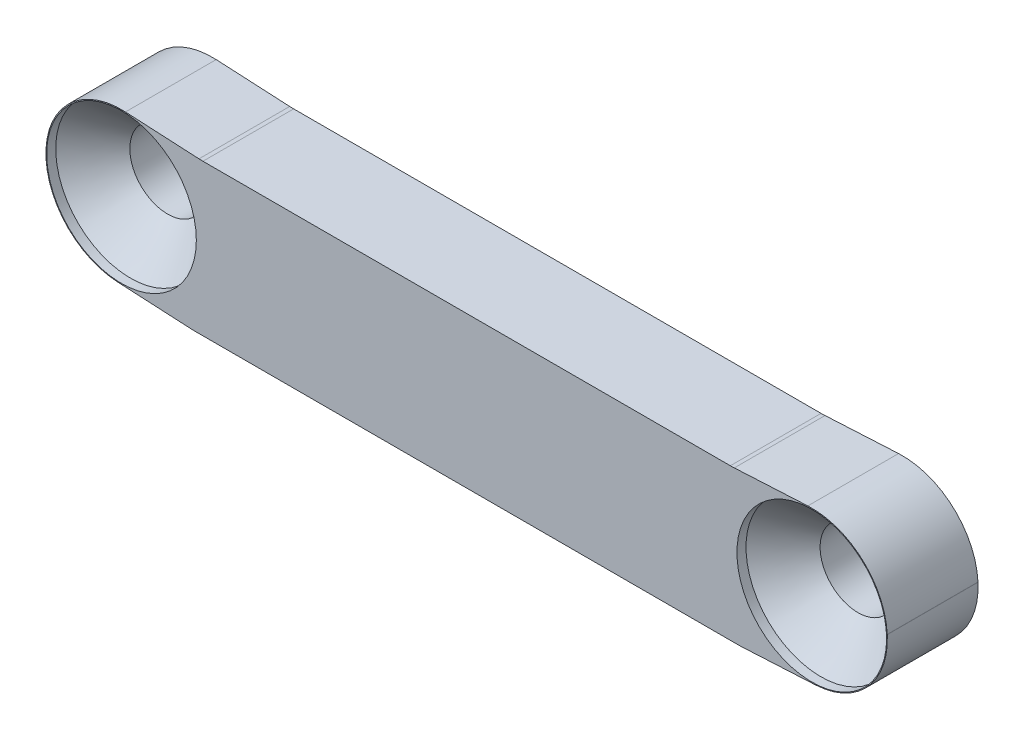
ISO-10303-21;
HEADER;
FILE_DESCRIPTION(('STEP AP214'),'2;1');
FILE_NAME('part.step','',(''),(''),'','','');
FILE_SCHEMA(('AUTOMOTIVE_DESIGN { 1 0 10303 214 1 1 1 1 }'));
ENDSEC;
DATA;
#1=APPLICATION_CONTEXT('core data for automotive mechanical design processes');
#2=APPLICATION_PROTOCOL_DEFINITION('international standard','automotive_design',2000,#1);
#3=PRODUCT_CONTEXT('',#1,'mechanical');
#4=PRODUCT('Part','Part','',(#3));
#5=PRODUCT_RELATED_PRODUCT_CATEGORY('part','',(#4));
#6=PRODUCT_DEFINITION_FORMATION('','',#4);
#7=PRODUCT_DEFINITION_CONTEXT('part definition',#1,'design');
#8=PRODUCT_DEFINITION('design','',#6,#7);
#9=PRODUCT_DEFINITION_SHAPE('','',#8);
#10=(LENGTH_UNIT() NAMED_UNIT(*) SI_UNIT(.MILLI.,.METRE.));
#11=(NAMED_UNIT(*) PLANE_ANGLE_UNIT() SI_UNIT($,.RADIAN.));
#12=(NAMED_UNIT(*) SI_UNIT($,.STERADIAN.) SOLID_ANGLE_UNIT());
#13=UNCERTAINTY_MEASURE_WITH_UNIT(LENGTH_MEASURE(1.E-05),#10,'distance_accuracy_value','');
#14=(GEOMETRIC_REPRESENTATION_CONTEXT(3) GLOBAL_UNCERTAINTY_ASSIGNED_CONTEXT((#13)) GLOBAL_UNIT_ASSIGNED_CONTEXT((#10,
#11,#12)) REPRESENTATION_CONTEXT('',''));
#15=CARTESIAN_POINT('',(0.,0.,0.));
#16=DIRECTION('',(0.,0.,1.));
#17=DIRECTION('',(1.,0.,0.));
#18=AXIS2_PLACEMENT_3D('',#15,#16,#17);
#19=CARTESIAN_POINT('',(-11.4135117467006,-21.9327209804877,3.));
#20=DIRECTION('',(0.,0.,-1.));
#21=DIRECTION('',(-1.,0.,0.));
#22=AXIS2_PLACEMENT_3D('',#19,#20,#21);
#23=CYLINDRICAL_SURFACE('',#22,1.25);
#24=CARTESIAN_POINT('',(-11.4135117467006,-21.9327209804877,0.));
#25=DIRECTION('',(0.,0.,1.));
#26=DIRECTION('',(1.,0.,0.));
#27=AXIS2_PLACEMENT_3D('',#24,#25,#26);
#28=CIRCLE('',#27,1.25);
#29=CARTESIAN_POINT('',(-10.1635117467006,-21.9327209804877,0.));
#30=VERTEX_POINT('',#29);
#31=EDGE_CURVE('E191',#30,#30,#28,.T.);
#32=ORIENTED_EDGE('',*,*,#31,.F.);
#33=EDGE_LOOP('',(#32));
#34=FACE_BOUND('',#33,.T.);
#35=CARTESIAN_POINT('',(-11.4135117467006,-21.9327209804877,1.475));
#36=DIRECTION('',(0.,0.,1.));
#37=DIRECTION('',(1.,0.,0.));
#38=AXIS2_PLACEMENT_3D('',#35,#36,#37);
#39=CIRCLE('',#38,1.25);
#40=CARTESIAN_POINT('',(-10.1635117467006,-21.9327209804877,1.475));
#41=VERTEX_POINT('',#40);
#42=EDGE_CURVE('E316',#41,#41,#39,.T.);
#43=ORIENTED_EDGE('',*,*,#42,.T.);
#44=EDGE_LOOP('',(#43));
#45=FACE_BOUND('',#44,.T.);
#46=ADVANCED_FACE('F37',(#34,#45),#23,.F.);
#47=CARTESIAN_POINT('',(11.4135117467006,-21.9327209804877,3.));
#48=DIRECTION('',(0.,0.,-1.));
#49=DIRECTION('',(-1.,0.,0.));
#50=AXIS2_PLACEMENT_3D('',#47,#48,#49);
#51=CYLINDRICAL_SURFACE('',#50,1.25);
#52=CARTESIAN_POINT('',(11.4135117467006,-21.9327209804877,0.));
#53=DIRECTION('',(0.,0.,1.));
#54=DIRECTION('',(1.,0.,0.));
#55=AXIS2_PLACEMENT_3D('',#52,#53,#54);
#56=CIRCLE('',#55,1.25);
#57=CARTESIAN_POINT('',(12.6635117467006,-21.9327209804877,0.));
#58=VERTEX_POINT('',#57);
#59=EDGE_CURVE('E194',#58,#58,#56,.T.);
#60=ORIENTED_EDGE('',*,*,#59,.F.);
#61=EDGE_LOOP('',(#60));
#62=FACE_BOUND('',#61,.T.);
#63=CARTESIAN_POINT('',(11.4135117467006,-21.9327209804877,1.475));
#64=DIRECTION('',(0.,0.,1.));
#65=DIRECTION('',(1.,0.,0.));
#66=AXIS2_PLACEMENT_3D('',#63,#64,#65);
#67=CIRCLE('',#66,1.25);
#68=CARTESIAN_POINT('',(12.6635117467006,-21.9327209804877,1.475));
#69=VERTEX_POINT('',#68);
#70=EDGE_CURVE('E288',#69,#69,#67,.T.);
#71=ORIENTED_EDGE('',*,*,#70,.T.);
#72=EDGE_LOOP('',(#71));
#73=FACE_BOUND('',#72,.T.);
#74=ADVANCED_FACE('F350',(#62,#73),#51,.F.);
#75=CARTESIAN_POINT('',(0.,-24.5601347079815,3.));
#76=DIRECTION('',(0.,1.,0.));
#77=DIRECTION('',(0.,0.,1.));
#78=AXIS2_PLACEMENT_3D('',#75,#76,#77);
#79=PLANE('',#78);
#80=DIRECTION('',(1.,0.,0.));
#81=VECTOR('',#80,1.);
#82=CARTESIAN_POINT('',(0.,-24.5601347079815,0.));
#83=LINE('',#82,#81);
#84=CARTESIAN_POINT('',(-8.9823129964985,-24.5601347079815,0.));
#85=VERTEX_POINT('',#84);
#86=CARTESIAN_POINT('',(8.98231299649857,-24.5601347079815,0.));
#87=VERTEX_POINT('',#86);
#88=EDGE_CURVE('E283',#85,#87,#83,.T.);
#89=ORIENTED_EDGE('',*,*,#88,.T.);
#90=DIRECTION('',(0.,0.,-1.));
#91=VECTOR('',#90,1.);
#92=CARTESIAN_POINT('',(8.98231299649857,-24.5601347079815,3.));
#93=LINE('',#92,#91);
#94=CARTESIAN_POINT('',(8.98231299649857,-24.5601347079815,3.));
#95=VERTEX_POINT('',#94);
#96=EDGE_CURVE('E227',#87,#95,#93,.F.);
#97=ORIENTED_EDGE('',*,*,#96,.T.);
#98=DIRECTION('',(1.,0.,0.));
#99=VECTOR('',#98,1.);
#100=CARTESIAN_POINT('',(0.,-24.5601347079815,3.));
#101=LINE('',#100,#99);
#102=CARTESIAN_POINT('',(-8.9823129964985,-24.5601347079815,3.));
#103=VERTEX_POINT('',#102);
#104=EDGE_CURVE('E197',#103,#95,#101,.T.);
#105=ORIENTED_EDGE('',*,*,#104,.F.);
#106=DIRECTION('',(0.,0.,-1.));
#107=VECTOR('',#106,1.);
#108=CARTESIAN_POINT('',(-8.9823129964985,-24.5601347079815,3.));
#109=LINE('',#108,#107);
#110=EDGE_CURVE('E224',#103,#85,#109,.T.);
#111=ORIENTED_EDGE('',*,*,#110,.T.);
#112=EDGE_LOOP('',(#89,#97,#105,#111));
#113=FACE_BOUND('',#112,.T.);
#114=ADVANCED_FACE('F356',(#113),#79,.F.);
#115=CARTESIAN_POINT('',(1.30839890607361,-24.9657383688643,3.));
#116=DIRECTION('',(-0.0523359562429444,0.998629534754574,0.));
#117=DIRECTION('',(-0.998629534754574,-0.0523359562429444,0.));
#118=AXIS2_PLACEMENT_3D('',#115,#116,#117);
#119=PLANE('',#118);
#120=DIRECTION('',(0.998629534754574,0.0523359562429444,0.));
#121=VECTOR('',#120,1.);
#122=CARTESIAN_POINT('',(1.30839890607361,-24.9657383688643,3.));
#123=LINE('',#122,#121);
#124=CARTESIAN_POINT('',(9.11315288710593,-24.556708544868,3.));
#125=VERTEX_POINT('',#124);
#126=CARTESIAN_POINT('',(11.544351637308,-24.4292948173742,3.));
#127=VERTEX_POINT('',#126);
#128=EDGE_CURVE('E304',#125,#127,#123,.T.);
#129=ORIENTED_EDGE('',*,*,#128,.F.);
#130=DIRECTION('',(0.,0.,-1.));
#131=VECTOR('',#130,1.);
#132=CARTESIAN_POINT('',(9.11315288710593,-24.556708544868,3.));
#133=LINE('',#132,#131);
#134=CARTESIAN_POINT('',(9.11315288710593,-24.556708544868,0.));
#135=VERTEX_POINT('',#134);
#136=EDGE_CURVE('E210',#125,#135,#133,.T.);
#137=ORIENTED_EDGE('',*,*,#136,.T.);
#138=DIRECTION('',(0.998629534754574,0.0523359562429444,0.));
#139=VECTOR('',#138,1.);
#140=CARTESIAN_POINT('',(1.30839890607361,-24.9657383688643,0.));
#141=LINE('',#140,#139);
#142=CARTESIAN_POINT('',(11.544351637308,-24.4292948173742,0.));
#143=VERTEX_POINT('',#142);
#144=EDGE_CURVE('E287',#135,#143,#141,.T.);
#145=ORIENTED_EDGE('',*,*,#144,.T.);
#146=DIRECTION('',(0.,0.,-1.));
#147=VECTOR('',#146,1.);
#148=CARTESIAN_POINT('',(11.544351637308,-24.4292948173742,3.));
#149=LINE('',#148,#147);
#150=EDGE_CURVE('E208',#143,#127,#149,.F.);
#151=ORIENTED_EDGE('',*,*,#150,.T.);
#152=EDGE_LOOP('',(#129,#137,#145,#151));
#153=FACE_BOUND('',#152,.T.);
#154=ADVANCED_FACE('F377',(#153),#119,.F.);
#155=CARTESIAN_POINT('',(12.7325265681208,0.667283442097539,3.));
#156=DIRECTION('',(-0.998629534754574,-0.0523359562429442,0.));
#157=DIRECTION('',(0.0523359562429442,-0.998629534754574,0.));
#158=AXIS2_PLACEMENT_3D('',#155,#156,#157);
#159=PLANE('',#158);
#160=DIRECTION('',(-0.0523359562429442,0.998629534754574,0.));
#161=VECTOR('',#160,1.);
#162=CARTESIAN_POINT('',(12.7325265681208,0.667283442097539,0.));
#163=LINE('',#162,#161);
#164=CARTESIAN_POINT('',(13.9100855835871,-21.8018810898804,0.));
#165=VERTEX_POINT('',#164);
#166=CARTESIAN_POINT('',(13.9097264683866,-21.7950287636532,0.));
#167=VERTEX_POINT('',#166);
#168=EDGE_CURVE('E263',#165,#167,#163,.T.);
#169=ORIENTED_EDGE('',*,*,#168,.T.);
#170=DIRECTION('',(0.,0.,-1.));
#171=VECTOR('',#170,1.);
#172=CARTESIAN_POINT('',(13.9097264683866,-21.7950287636532,3.));
#173=LINE('',#172,#171);
#174=CARTESIAN_POINT('',(13.9097264683866,-21.7950287636532,3.));
#175=VERTEX_POINT('',#174);
#176=EDGE_CURVE('E162',#167,#175,#173,.F.);
#177=ORIENTED_EDGE('',*,*,#176,.T.);
#178=DIRECTION('',(-0.0523359562429442,0.998629534754574,0.));
#179=VECTOR('',#178,1.);
#180=CARTESIAN_POINT('',(12.7325265681208,0.667283442097539,3.));
#181=LINE('',#180,#179);
#182=CARTESIAN_POINT('',(13.9100855835871,-21.8018810898804,3.));
#183=VERTEX_POINT('',#182);
#184=EDGE_CURVE('E277',#183,#175,#181,.T.);
#185=ORIENTED_EDGE('',*,*,#184,.F.);
#186=DIRECTION('',(0.,0.,-1.));
#187=VECTOR('',#186,1.);
#188=CARTESIAN_POINT('',(13.9100855835871,-21.8018810898804,3.));
#189=LINE('',#188,#187);
#190=EDGE_CURVE('E249',#183,#165,#189,.T.);
#191=ORIENTED_EDGE('',*,*,#190,.T.);
#192=EDGE_LOOP('',(#169,#177,#185,#191));
#193=FACE_BOUND('',#192,.T.);
#194=ADVANCED_FACE('F295',(#193),#159,.F.);
#195=CARTESIAN_POINT('',(1.0463600096584,-19.9657383688643,3.));
#196=DIRECTION('',(-0.0523359562429444,0.998629534754574,0.));
#197=DIRECTION('',(-0.998629534754574,-0.0523359562429444,0.));
#198=AXIS2_PLACEMENT_3D('',#195,#196,#197);
#199=PLANE('',#198);
#200=DIRECTION('',(0.998629534754574,0.0523359562429444,0.));
#201=VECTOR('',#200,1.);
#202=CARTESIAN_POINT('',(1.0463600096584,-19.9657383688643,0.));
#203=LINE('',#202,#201);
#204=CARTESIAN_POINT('',(8.85111399069079,-19.556708544868,0.));
#205=VERTEX_POINT('',#204);
#206=CARTESIAN_POINT('',(11.2823127408928,-19.4292948173742,0.));
#207=VERTEX_POINT('',#206);
#208=EDGE_CURVE('E186',#205,#207,#203,.T.);
#209=ORIENTED_EDGE('',*,*,#208,.F.);
#210=DIRECTION('',(0.,0.,-1.));
#211=VECTOR('',#210,1.);
#212=CARTESIAN_POINT('',(8.85111399069079,-19.556708544868,3.));
#213=LINE('',#212,#211);
#214=CARTESIAN_POINT('',(8.85111399069079,-19.556708544868,3.));
#215=VERTEX_POINT('',#214);
#216=EDGE_CURVE('E206',#205,#215,#213,.F.);
#217=ORIENTED_EDGE('',*,*,#216,.T.);
#218=DIRECTION('',(0.998629534754574,0.0523359562429444,0.));
#219=VECTOR('',#218,1.);
#220=CARTESIAN_POINT('',(1.0463600096584,-19.9657383688643,3.));
#221=LINE('',#220,#219);
#222=CARTESIAN_POINT('',(11.2823127408928,-19.4292948173742,3.));
#223=VERTEX_POINT('',#222);
#224=EDGE_CURVE('E271',#215,#223,#221,.T.);
#225=ORIENTED_EDGE('',*,*,#224,.T.);
#226=DIRECTION('',(0.,0.,-1.));
#227=VECTOR('',#226,1.);
#228=CARTESIAN_POINT('',(11.2823127408928,-19.4292948173742,0.));
#229=LINE('',#228,#227);
#230=EDGE_CURVE('E203',#223,#207,#229,.T.);
#231=ORIENTED_EDGE('',*,*,#230,.T.);
#232=EDGE_LOOP('',(#209,#217,#225,#231));
#233=FACE_BOUND('',#232,.T.);
#234=ADVANCED_FACE('F259',(#233),#199,.T.);
#235=CARTESIAN_POINT('',(0.,-19.5601347079815,3.));
#236=DIRECTION('',(0.,1.,0.));
#237=DIRECTION('',(0.,0.,1.));
#238=AXIS2_PLACEMENT_3D('',#235,#236,#237);
#239=PLANE('',#238);
#240=DIRECTION('',(1.,0.,0.));
#241=VECTOR('',#240,1.);
#242=CARTESIAN_POINT('',(0.,-19.5601347079815,0.));
#243=LINE('',#242,#241);
#244=CARTESIAN_POINT('',(-8.72027410008343,-19.5601347079815,0.));
#245=VERTEX_POINT('',#244);
#246=CARTESIAN_POINT('',(8.72027410008343,-19.5601347079815,0.));
#247=VERTEX_POINT('',#246);
#248=EDGE_CURVE('E181',#245,#247,#243,.T.);
#249=ORIENTED_EDGE('',*,*,#248,.F.);
#250=DIRECTION('',(0.,0.,-1.));
#251=VECTOR('',#250,1.);
#252=CARTESIAN_POINT('',(-8.72027410008343,-19.5601347079815,3.));
#253=LINE('',#252,#251);
#254=CARTESIAN_POINT('',(-8.72027410008343,-19.5601347079815,3.));
#255=VERTEX_POINT('',#254);
#256=EDGE_CURVE('E156',#245,#255,#253,.F.);
#257=ORIENTED_EDGE('',*,*,#256,.T.);
#258=DIRECTION('',(1.,0.,0.));
#259=VECTOR('',#258,1.);
#260=CARTESIAN_POINT('',(0.,-19.5601347079815,3.));
#261=LINE('',#260,#259);
#262=CARTESIAN_POINT('',(8.72027410008343,-19.5601347079815,3.));
#263=VERTEX_POINT('',#262);
#264=EDGE_CURVE('E270',#255,#263,#261,.T.);
#265=ORIENTED_EDGE('',*,*,#264,.T.);
#266=DIRECTION('',(0.,0.,-1.));
#267=VECTOR('',#266,1.);
#268=CARTESIAN_POINT('',(8.72027410008343,-19.5601347079815,0.));
#269=LINE('',#268,#267);
#270=EDGE_CURVE('E172',#263,#247,#269,.T.);
#271=ORIENTED_EDGE('',*,*,#270,.T.);
#272=EDGE_LOOP('',(#249,#257,#265,#271));
#273=FACE_BOUND('',#272,.T.);
#274=ADVANCED_FACE('F273',(#273),#239,.T.);
#275=CARTESIAN_POINT('',(-1.0463600096584,-19.9657383688643,3.));
#276=DIRECTION('',(-0.0523359562429444,-0.998629534754574,0.));
#277=DIRECTION('',(0.998629534754574,-0.0523359562429444,0.));
#278=AXIS2_PLACEMENT_3D('',#275,#276,#277);
#279=PLANE('',#278);
#280=DIRECTION('',(-0.998629534754574,0.0523359562429444,0.));
#281=VECTOR('',#280,1.);
#282=CARTESIAN_POINT('',(-1.0463600096584,-19.9657383688643,3.));
#283=LINE('',#282,#281);
#284=CARTESIAN_POINT('',(-8.85111399069079,-19.556708544868,3.));
#285=VERTEX_POINT('',#284);
#286=CARTESIAN_POINT('',(-11.2823127408928,-19.4292948173742,3.));
#287=VERTEX_POINT('',#286);
#288=EDGE_CURVE('E171',#285,#287,#283,.T.);
#289=ORIENTED_EDGE('',*,*,#288,.F.);
#290=DIRECTION('',(0.,0.,-1.));
#291=VECTOR('',#290,1.);
#292=CARTESIAN_POINT('',(-8.85111399069079,-19.556708544868,3.));
#293=LINE('',#292,#291);
#294=CARTESIAN_POINT('',(-8.85111399069079,-19.556708544868,0.));
#295=VERTEX_POINT('',#294);
#296=EDGE_CURVE('E155',#285,#295,#293,.T.);
#297=ORIENTED_EDGE('',*,*,#296,.T.);
#298=DIRECTION('',(-0.998629534754574,0.0523359562429444,0.));
#299=VECTOR('',#298,1.);
#300=CARTESIAN_POINT('',(-1.0463600096584,-19.9657383688643,0.));
#301=LINE('',#300,#299);
#302=CARTESIAN_POINT('',(-11.2823127408928,-19.4292948173742,0.));
#303=VERTEX_POINT('',#302);
#304=EDGE_CURVE('E168',#295,#303,#301,.T.);
#305=ORIENTED_EDGE('',*,*,#304,.T.);
#306=DIRECTION('',(0.,0.,-1.));
#307=VECTOR('',#306,1.);
#308=CARTESIAN_POINT('',(-11.2823127408928,-19.4292948173742,3.));
#309=LINE('',#308,#307);
#310=EDGE_CURVE('E173',#303,#287,#309,.F.);
#311=ORIENTED_EDGE('',*,*,#310,.T.);
#312=EDGE_LOOP('',(#289,#297,#305,#311));
#313=FACE_BOUND('',#312,.T.);
#314=ADVANCED_FACE('F167',(#313),#279,.F.);
#315=CARTESIAN_POINT('',(-12.7325265681208,0.667283442097539,3.));
#316=DIRECTION('',(0.998629534754574,-0.0523359562429442,0.));
#317=DIRECTION('',(0.0523359562429442,0.998629534754574,0.));
#318=AXIS2_PLACEMENT_3D('',#315,#316,#317);
#319=PLANE('',#318);
#320=DIRECTION('',(-0.0523359562429442,-0.998629534754574,0.));
#321=VECTOR('',#320,1.);
#322=CARTESIAN_POINT('',(-12.7325265681208,0.667283442097539,3.));
#323=LINE('',#322,#321);
#324=CARTESIAN_POINT('',(-13.9097264683866,-21.7950287636533,3.));
#325=VERTEX_POINT('',#324);
#326=CARTESIAN_POINT('',(-13.9100855835871,-21.8018810898804,3.));
#327=VERTEX_POINT('',#326);
#328=EDGE_CURVE('E275',#325,#327,#323,.T.);
#329=ORIENTED_EDGE('',*,*,#328,.F.);
#330=DIRECTION('',(0.,0.,-1.));
#331=VECTOR('',#330,1.);
#332=CARTESIAN_POINT('',(-13.9097264683866,-21.7950287636532,3.));
#333=LINE('',#332,#331);
#334=CARTESIAN_POINT('',(-13.9097264683866,-21.7950287636533,0.));
#335=VERTEX_POINT('',#334);
#336=EDGE_CURVE('E246',#325,#335,#333,.T.);
#337=ORIENTED_EDGE('',*,*,#336,.T.);
#338=DIRECTION('',(-0.0523359562429442,-0.998629534754574,0.));
#339=VECTOR('',#338,1.);
#340=CARTESIAN_POINT('',(-12.7325265681208,0.667283442097539,0.));
#341=LINE('',#340,#339);
#342=CARTESIAN_POINT('',(-13.9100855835871,-21.8018810898804,0.));
#343=VERTEX_POINT('',#342);
#344=EDGE_CURVE('E180',#335,#343,#341,.T.);
#345=ORIENTED_EDGE('',*,*,#344,.T.);
#346=DIRECTION('',(0.,0.,-1.));
#347=VECTOR('',#346,1.);
#348=CARTESIAN_POINT('',(-13.9100855835871,-21.8018810898804,3.));
#349=LINE('',#348,#347);
#350=EDGE_CURVE('E244',#343,#327,#349,.F.);
#351=ORIENTED_EDGE('',*,*,#350,.T.);
#352=EDGE_LOOP('',(#329,#337,#345,#351));
#353=FACE_BOUND('',#352,.T.);
#354=ADVANCED_FACE('F365',(#353),#319,.F.);
#355=CARTESIAN_POINT('',(-1.30839890607361,-24.9657383688643,3.));
#356=DIRECTION('',(0.0523359562429444,0.998629534754574,0.));
#357=DIRECTION('',(-0.998629534754574,0.0523359562429444,0.));
#358=AXIS2_PLACEMENT_3D('',#355,#356,#357);
#359=PLANE('',#358);
#360=DIRECTION('',(0.998629534754574,-0.0523359562429444,0.));
#361=VECTOR('',#360,1.);
#362=CARTESIAN_POINT('',(-1.30839890607361,-24.9657383688643,0.));
#363=LINE('',#362,#361);
#364=CARTESIAN_POINT('',(-11.544351637308,-24.4292948173742,0.));
#365=VERTEX_POINT('',#364);
#366=CARTESIAN_POINT('',(-9.11315288710587,-24.556708544868,0.));
#367=VERTEX_POINT('',#366);
#368=EDGE_CURVE('E184',#365,#367,#363,.T.);
#369=ORIENTED_EDGE('',*,*,#368,.T.);
#370=DIRECTION('',(0.,0.,-1.));
#371=VECTOR('',#370,1.);
#372=CARTESIAN_POINT('',(-9.11315288710586,-24.556708544868,3.));
#373=LINE('',#372,#371);
#374=CARTESIAN_POINT('',(-9.11315288710587,-24.556708544868,3.));
#375=VERTEX_POINT('',#374);
#376=EDGE_CURVE('E52',#367,#375,#373,.F.);
#377=ORIENTED_EDGE('',*,*,#376,.T.);
#378=DIRECTION('',(0.998629534754574,-0.0523359562429444,0.));
#379=VECTOR('',#378,1.);
#380=CARTESIAN_POINT('',(-1.30839890607361,-24.9657383688643,3.));
#381=LINE('',#380,#379);
#382=CARTESIAN_POINT('',(-11.544351637308,-24.4292948173742,3.));
#383=VERTEX_POINT('',#382);
#384=EDGE_CURVE('E198',#383,#375,#381,.T.);
#385=ORIENTED_EDGE('',*,*,#384,.F.);
#386=DIRECTION('',(0.,0.,-1.));
#387=VECTOR('',#386,1.);
#388=CARTESIAN_POINT('',(-11.544351637308,-24.4292948173742,3.));
#389=LINE('',#388,#387);
#390=EDGE_CURVE('E240',#383,#365,#389,.T.);
#391=ORIENTED_EDGE('',*,*,#390,.T.);
#392=EDGE_LOOP('',(#369,#377,#385,#391));
#393=FACE_BOUND('',#392,.T.);
#394=ADVANCED_FACE('F330',(#393),#359,.F.);
#395=CARTESIAN_POINT('',(0.,0.,3.));
#396=DIRECTION('',(0.,0.,1.));
#397=DIRECTION('',(1.,0.,0.));
#398=AXIS2_PLACEMENT_3D('',#395,#396,#397);
#399=PLANE('',#398);
#400=CARTESIAN_POINT('',(-11.4135117467006,-21.9327209804877,3.));
#401=DIRECTION('',(0.,0.,1.));
#402=DIRECTION('',(1.,0.,0.));
#403=AXIS2_PLACEMENT_3D('',#400,#401,#402);
#404=CIRCLE('',#403,2.475);
#405=CARTESIAN_POINT('',(-8.93851174670063,-21.9327209804877,3.));
#406=VERTEX_POINT('',#405);
#407=EDGE_CURVE('E322',#406,#406,#404,.T.);
#408=ORIENTED_EDGE('',*,*,#407,.F.);
#409=EDGE_LOOP('',(#408));
#410=FACE_BOUND('',#409,.T.);
#411=CARTESIAN_POINT('',(11.4135117467006,-21.9327209804877,3.));
#412=DIRECTION('',(0.,0.,1.));
#413=DIRECTION('',(1.,0.,0.));
#414=AXIS2_PLACEMENT_3D('',#411,#412,#413);
#415=CIRCLE('',#414,2.475);
#416=CARTESIAN_POINT('',(13.8885117467006,-21.9327209804877,3.));
#417=VERTEX_POINT('',#416);
#418=EDGE_CURVE('E313',#417,#417,#415,.T.);
#419=ORIENTED_EDGE('',*,*,#418,.F.);
#420=EDGE_LOOP('',(#419));
#421=FACE_BOUND('',#420,.T.);
#422=ORIENTED_EDGE('',*,*,#104,.T.);
#423=CARTESIAN_POINT('',(8.98231299649857,-22.0601347079815,3.));
#424=DIRECTION('',(0.,0.,1.));
#425=DIRECTION('',(1.,0.,0.));
#426=AXIS2_PLACEMENT_3D('',#423,#424,#425);
#427=CIRCLE('',#426,2.5);
#428=EDGE_CURVE('E238',#95,#125,#427,.T.);
#429=ORIENTED_EDGE('',*,*,#428,.T.);
#430=ORIENTED_EDGE('',*,*,#128,.T.);
#431=CARTESIAN_POINT('',(11.4135117467006,-21.9327209804877,3.));
#432=DIRECTION('',(0.,0.,1.));
#433=DIRECTION('',(1.,0.,0.));
#434=AXIS2_PLACEMENT_3D('',#431,#432,#433);
#435=CIRCLE('',#434,2.5);
#436=EDGE_CURVE('E229',#127,#183,#435,.T.);
#437=ORIENTED_EDGE('',*,*,#436,.T.);
#438=ORIENTED_EDGE('',*,*,#184,.T.);
#439=CARTESIAN_POINT('',(11.4131526315001,-21.9258686542606,3.));
#440=DIRECTION('',(0.,0.,1.));
#441=DIRECTION('',(1.,0.,0.));
#442=AXIS2_PLACEMENT_3D('',#439,#440,#441);
#443=CIRCLE('',#442,2.5);
#444=EDGE_CURVE('E231',#175,#223,#443,.T.);
#445=ORIENTED_EDGE('',*,*,#444,.T.);
#446=ORIENTED_EDGE('',*,*,#224,.F.);
#447=CARTESIAN_POINT('',(8.72027410008343,-17.0601347079815,3.));
#448=DIRECTION('',(0.,0.,1.));
#449=DIRECTION('',(1.,0.,0.));
#450=AXIS2_PLACEMENT_3D('',#447,#448,#449);
#451=CIRCLE('',#450,2.5);
#452=EDGE_CURVE('E11',#215,#263,#451,.F.);
#453=ORIENTED_EDGE('',*,*,#452,.T.);
#454=ORIENTED_EDGE('',*,*,#264,.F.);
#455=CARTESIAN_POINT('',(-8.72027410008343,-17.0601347079815,3.));
#456=DIRECTION('',(0.,0.,1.));
#457=DIRECTION('',(1.,0.,0.));
#458=AXIS2_PLACEMENT_3D('',#455,#456,#457);
#459=CIRCLE('',#458,2.5);
#460=EDGE_CURVE('E161',#255,#285,#459,.F.);
#461=ORIENTED_EDGE('',*,*,#460,.T.);
#462=ORIENTED_EDGE('',*,*,#288,.T.);
#463=CARTESIAN_POINT('',(-11.4131526315001,-21.9258686542606,3.));
#464=DIRECTION('',(0.,0.,1.));
#465=DIRECTION('',(1.,0.,0.));
#466=AXIS2_PLACEMENT_3D('',#463,#464,#465);
#467=CIRCLE('',#466,2.5);
#468=EDGE_CURVE('E234',#287,#325,#467,.T.);
#469=ORIENTED_EDGE('',*,*,#468,.T.);
#470=ORIENTED_EDGE('',*,*,#328,.T.);
#471=CARTESIAN_POINT('',(-11.4135117467006,-21.9327209804877,3.));
#472=DIRECTION('',(0.,0.,1.));
#473=DIRECTION('',(1.,0.,0.));
#474=AXIS2_PLACEMENT_3D('',#471,#472,#473);
#475=CIRCLE('',#474,2.5);
#476=EDGE_CURVE('E59',#327,#383,#475,.T.);
#477=ORIENTED_EDGE('',*,*,#476,.T.);
#478=ORIENTED_EDGE('',*,*,#384,.T.);
#479=CARTESIAN_POINT('',(-8.9823129964985,-22.0601347079815,3.));
#480=DIRECTION('',(0.,0.,1.));
#481=DIRECTION('',(1.,0.,0.));
#482=AXIS2_PLACEMENT_3D('',#479,#480,#481);
#483=CIRCLE('',#482,2.5);
#484=EDGE_CURVE('E236',#375,#103,#483,.T.);
#485=ORIENTED_EDGE('',*,*,#484,.T.);
#486=EDGE_LOOP('',(#422,#429,#430,#437,#438,#445,#446,#453,#454,#461,#462,#469,#470,#477,#478,#485));
#487=FACE_BOUND('',#486,.T.);
#488=ADVANCED_FACE('F269',(#410,#421,#487),#399,.T.);
#489=CARTESIAN_POINT('',(0.,0.,0.));
#490=DIRECTION('',(0.,0.,1.));
#491=DIRECTION('',(1.,0.,0.));
#492=AXIS2_PLACEMENT_3D('',#489,#490,#491);
#493=PLANE('',#492);
#494=ORIENTED_EDGE('',*,*,#144,.F.);
#495=CARTESIAN_POINT('',(8.98231299649857,-22.0601347079815,0.));
#496=DIRECTION('',(0.,0.,1.));
#497=DIRECTION('',(1.,0.,0.));
#498=AXIS2_PLACEMENT_3D('',#495,#496,#497);
#499=CIRCLE('',#498,2.5);
#500=EDGE_CURVE('E222',#135,#87,#499,.F.);
#501=ORIENTED_EDGE('',*,*,#500,.T.);
#502=ORIENTED_EDGE('',*,*,#88,.F.);
#503=CARTESIAN_POINT('',(-8.9823129964985,-22.0601347079815,0.));
#504=DIRECTION('',(0.,0.,1.));
#505=DIRECTION('',(1.,0.,0.));
#506=AXIS2_PLACEMENT_3D('',#503,#504,#505);
#507=CIRCLE('',#506,2.5);
#508=EDGE_CURVE('E220',#85,#367,#507,.F.);
#509=ORIENTED_EDGE('',*,*,#508,.T.);
#510=ORIENTED_EDGE('',*,*,#368,.F.);
#511=CARTESIAN_POINT('',(-11.4135117467006,-21.9327209804877,0.));
#512=DIRECTION('',(0.,0.,1.));
#513=DIRECTION('',(1.,0.,0.));
#514=AXIS2_PLACEMENT_3D('',#511,#512,#513);
#515=CIRCLE('',#514,2.5);
#516=EDGE_CURVE('E217',#365,#343,#515,.F.);
#517=ORIENTED_EDGE('',*,*,#516,.T.);
#518=ORIENTED_EDGE('',*,*,#344,.F.);
#519=CARTESIAN_POINT('',(-11.4131526315001,-21.9258686542606,0.));
#520=DIRECTION('',(0.,0.,1.));
#521=DIRECTION('',(1.,0.,0.));
#522=AXIS2_PLACEMENT_3D('',#519,#520,#521);
#523=CIRCLE('',#522,2.5);
#524=EDGE_CURVE('E179',#335,#303,#523,.F.);
#525=ORIENTED_EDGE('',*,*,#524,.T.);
#526=ORIENTED_EDGE('',*,*,#304,.F.);
#527=CARTESIAN_POINT('',(-8.72027410008343,-17.0601347079815,0.));
#528=DIRECTION('',(0.,0.,1.));
#529=DIRECTION('',(1.,0.,0.));
#530=AXIS2_PLACEMENT_3D('',#527,#528,#529);
#531=CIRCLE('',#530,2.5);
#532=EDGE_CURVE('E151',#295,#245,#531,.T.);
#533=ORIENTED_EDGE('',*,*,#532,.T.);
#534=ORIENTED_EDGE('',*,*,#248,.T.);
#535=CARTESIAN_POINT('',(8.72027410008343,-17.0601347079815,0.));
#536=DIRECTION('',(0.,0.,1.));
#537=DIRECTION('',(1.,0.,0.));
#538=AXIS2_PLACEMENT_3D('',#535,#536,#537);
#539=CIRCLE('',#538,2.5);
#540=EDGE_CURVE('E45',#247,#205,#539,.T.);
#541=ORIENTED_EDGE('',*,*,#540,.T.);
#542=ORIENTED_EDGE('',*,*,#208,.T.);
#543=CARTESIAN_POINT('',(11.4131526315001,-21.9258686542606,0.));
#544=DIRECTION('',(0.,0.,1.));
#545=DIRECTION('',(1.,0.,0.));
#546=AXIS2_PLACEMENT_3D('',#543,#544,#545);
#547=CIRCLE('',#546,2.5);
#548=EDGE_CURVE('E215',#207,#167,#547,.F.);
#549=ORIENTED_EDGE('',*,*,#548,.T.);
#550=ORIENTED_EDGE('',*,*,#168,.F.);
#551=CARTESIAN_POINT('',(11.4135117467006,-21.9327209804877,0.));
#552=DIRECTION('',(0.,0.,1.));
#553=DIRECTION('',(1.,0.,0.));
#554=AXIS2_PLACEMENT_3D('',#551,#552,#553);
#555=CIRCLE('',#554,2.5);
#556=EDGE_CURVE('E213',#165,#143,#555,.F.);
#557=ORIENTED_EDGE('',*,*,#556,.T.);
#558=EDGE_LOOP('',(#494,#501,#502,#509,#510,#517,#518,#525,#526,#533,#534,#541,#542,#549,#550,#557));
#559=FACE_BOUND('',#558,.T.);
#560=ORIENTED_EDGE('',*,*,#31,.T.);
#561=EDGE_LOOP('',(#560));
#562=FACE_BOUND('',#561,.T.);
#563=ORIENTED_EDGE('',*,*,#59,.T.);
#564=EDGE_LOOP('',(#563));
#565=FACE_BOUND('',#564,.T.);
#566=ADVANCED_FACE('F176',(#559,#562,#565),#493,.F.);
#567=CARTESIAN_POINT('',(-8.72027410008343,-17.0601347079815,3.));
#568=DIRECTION('',(0.,0.,-1.));
#569=DIRECTION('',(-1.,0.,0.));
#570=AXIS2_PLACEMENT_3D('',#567,#568,#569);
#571=CYLINDRICAL_SURFACE('',#570,2.5);
#572=ORIENTED_EDGE('',*,*,#460,.F.);
#573=ORIENTED_EDGE('',*,*,#256,.F.);
#574=ORIENTED_EDGE('',*,*,#532,.F.);
#575=ORIENTED_EDGE('',*,*,#296,.F.);
#576=EDGE_LOOP('',(#572,#573,#574,#575));
#577=FACE_BOUND('',#576,.T.);
#578=ADVANCED_FACE('F154',(#577),#571,.F.);
#579=CARTESIAN_POINT('',(8.72027410008343,-17.0601347079815,3.));
#580=DIRECTION('',(0.,0.,1.));
#581=DIRECTION('',(1.,0.,0.));
#582=AXIS2_PLACEMENT_3D('',#579,#580,#581);
#583=CYLINDRICAL_SURFACE('',#582,2.5);
#584=ORIENTED_EDGE('',*,*,#452,.F.);
#585=ORIENTED_EDGE('',*,*,#216,.F.);
#586=ORIENTED_EDGE('',*,*,#540,.F.);
#587=ORIENTED_EDGE('',*,*,#270,.F.);
#588=EDGE_LOOP('',(#584,#585,#586,#587));
#589=FACE_BOUND('',#588,.T.);
#590=ADVANCED_FACE('F265',(#589),#583,.F.);
#591=CARTESIAN_POINT('',(8.98231299649857,-22.0601347079815,3.));
#592=DIRECTION('',(0.,0.,-1.));
#593=DIRECTION('',(-1.,0.,0.));
#594=AXIS2_PLACEMENT_3D('',#591,#592,#593);
#595=CYLINDRICAL_SURFACE('',#594,2.5);
#596=ORIENTED_EDGE('',*,*,#428,.F.);
#597=ORIENTED_EDGE('',*,*,#96,.F.);
#598=ORIENTED_EDGE('',*,*,#500,.F.);
#599=ORIENTED_EDGE('',*,*,#136,.F.);
#600=EDGE_LOOP('',(#596,#597,#598,#599));
#601=FACE_BOUND('',#600,.T.);
#602=ADVANCED_FACE('F388',(#601),#595,.T.);
#603=CARTESIAN_POINT('',(-8.9823129964985,-22.0601347079815,3.));
#604=DIRECTION('',(0.,0.,-1.));
#605=DIRECTION('',(-1.,0.,0.));
#606=AXIS2_PLACEMENT_3D('',#603,#604,#605);
#607=CYLINDRICAL_SURFACE('',#606,2.5);
#608=ORIENTED_EDGE('',*,*,#484,.F.);
#609=ORIENTED_EDGE('',*,*,#376,.F.);
#610=ORIENTED_EDGE('',*,*,#508,.F.);
#611=ORIENTED_EDGE('',*,*,#110,.F.);
#612=EDGE_LOOP('',(#608,#609,#610,#611));
#613=FACE_BOUND('',#612,.T.);
#614=ADVANCED_FACE('F391',(#613),#607,.T.);
#615=CARTESIAN_POINT('',(-11.4131526315001,-21.9258686542606,3.));
#616=DIRECTION('',(0.,0.,-1.));
#617=DIRECTION('',(-1.,0.,0.));
#618=AXIS2_PLACEMENT_3D('',#615,#616,#617);
#619=CYLINDRICAL_SURFACE('',#618,2.5);
#620=ORIENTED_EDGE('',*,*,#468,.F.);
#621=ORIENTED_EDGE('',*,*,#310,.F.);
#622=ORIENTED_EDGE('',*,*,#524,.F.);
#623=ORIENTED_EDGE('',*,*,#336,.F.);
#624=EDGE_LOOP('',(#620,#621,#622,#623));
#625=FACE_BOUND('',#624,.T.);
#626=ADVANCED_FACE('F395',(#625),#619,.T.);
#627=CARTESIAN_POINT('',(-11.4135117467006,-21.9327209804877,3.));
#628=DIRECTION('',(0.,0.,-1.));
#629=DIRECTION('',(-1.,0.,0.));
#630=AXIS2_PLACEMENT_3D('',#627,#628,#629);
#631=CYLINDRICAL_SURFACE('',#630,2.5);
#632=ORIENTED_EDGE('',*,*,#476,.F.);
#633=ORIENTED_EDGE('',*,*,#350,.F.);
#634=ORIENTED_EDGE('',*,*,#516,.F.);
#635=ORIENTED_EDGE('',*,*,#390,.F.);
#636=EDGE_LOOP('',(#632,#633,#634,#635));
#637=FACE_BOUND('',#636,.T.);
#638=ADVANCED_FACE('F399',(#637),#631,.T.);
#639=CARTESIAN_POINT('',(11.4131526315001,-21.9258686542606,3.));
#640=DIRECTION('',(0.,0.,1.));
#641=DIRECTION('',(1.,0.,0.));
#642=AXIS2_PLACEMENT_3D('',#639,#640,#641);
#643=CYLINDRICAL_SURFACE('',#642,2.5);
#644=ORIENTED_EDGE('',*,*,#444,.F.);
#645=ORIENTED_EDGE('',*,*,#176,.F.);
#646=ORIENTED_EDGE('',*,*,#548,.F.);
#647=ORIENTED_EDGE('',*,*,#230,.F.);
#648=EDGE_LOOP('',(#644,#645,#646,#647));
#649=FACE_BOUND('',#648,.T.);
#650=ADVANCED_FACE('F301',(#649),#643,.T.);
#651=CARTESIAN_POINT('',(11.4135117467006,-21.9327209804877,3.));
#652=DIRECTION('',(0.,0.,-1.));
#653=DIRECTION('',(-1.,0.,0.));
#654=AXIS2_PLACEMENT_3D('',#651,#652,#653);
#655=CYLINDRICAL_SURFACE('',#654,2.5);
#656=ORIENTED_EDGE('',*,*,#436,.F.);
#657=ORIENTED_EDGE('',*,*,#150,.F.);
#658=ORIENTED_EDGE('',*,*,#556,.F.);
#659=ORIENTED_EDGE('',*,*,#190,.F.);
#660=EDGE_LOOP('',(#656,#657,#658,#659));
#661=FACE_BOUND('',#660,.T.);
#662=ADVANCED_FACE('F39',(#661),#655,.T.);
#663=CARTESIAN_POINT('',(11.4135117467006,-21.9327209804877,2.7));
#664=DIRECTION('',(0.,0.,1.));
#665=DIRECTION('',(1.,0.,0.));
#666=AXIS2_PLACEMENT_3D('',#663,#664,#665);
#667=CONICAL_SURFACE('',#666,2.475,0.785398163397448);
#668=ORIENTED_EDGE('',*,*,#70,.F.);
#669=EDGE_LOOP('',(#668));
#670=FACE_BOUND('',#669,.T.);
#671=CARTESIAN_POINT('',(11.4135117467006,-21.9327209804877,2.7));
#672=DIRECTION('',(0.,0.,1.));
#673=DIRECTION('',(1.,0.,0.));
#674=AXIS2_PLACEMENT_3D('',#671,#672,#673);
#675=CIRCLE('',#674,2.475);
#676=CARTESIAN_POINT('',(13.8885117467006,-21.9327209804877,2.7));
#677=VERTEX_POINT('',#676);
#678=EDGE_CURVE('E310',#677,#677,#675,.T.);
#679=ORIENTED_EDGE('',*,*,#678,.T.);
#680=EDGE_LOOP('',(#679));
#681=FACE_BOUND('',#680,.T.);
#682=ADVANCED_FACE('F337',(#670,#681),#667,.F.);
#683=CARTESIAN_POINT('',(11.4135117467006,-21.9327209804877,3.));
#684=DIRECTION('',(0.,0.,1.));
#685=DIRECTION('',(1.,0.,0.));
#686=AXIS2_PLACEMENT_3D('',#683,#684,#685);
#687=CYLINDRICAL_SURFACE('',#686,2.475);
#688=ORIENTED_EDGE('',*,*,#678,.F.);
#689=EDGE_LOOP('',(#688));
#690=FACE_BOUND('',#689,.T.);
#691=ORIENTED_EDGE('',*,*,#418,.T.);
#692=EDGE_LOOP('',(#691));
#693=FACE_BOUND('',#692,.T.);
#694=ADVANCED_FACE('F334',(#690,#693),#687,.F.);
#695=CARTESIAN_POINT('',(-11.4135117467006,-21.9327209804877,2.7));
#696=DIRECTION('',(0.,0.,1.));
#697=DIRECTION('',(1.,0.,0.));
#698=AXIS2_PLACEMENT_3D('',#695,#696,#697);
#699=CONICAL_SURFACE('',#698,2.475,0.785398163397448);
#700=ORIENTED_EDGE('',*,*,#42,.F.);
#701=EDGE_LOOP('',(#700));
#702=FACE_BOUND('',#701,.T.);
#703=CARTESIAN_POINT('',(-11.4135117467006,-21.9327209804877,2.7));
#704=DIRECTION('',(0.,0.,1.));
#705=DIRECTION('',(1.,0.,0.));
#706=AXIS2_PLACEMENT_3D('',#703,#704,#705);
#707=CIRCLE('',#706,2.475);
#708=CARTESIAN_POINT('',(-8.93851174670063,-21.9327209804877,2.7));
#709=VERTEX_POINT('',#708);
#710=EDGE_CURVE('E319',#709,#709,#707,.T.);
#711=ORIENTED_EDGE('',*,*,#710,.T.);
#712=EDGE_LOOP('',(#711));
#713=FACE_BOUND('',#712,.T.);
#714=ADVANCED_FACE('F336',(#702,#713),#699,.F.);
#715=CARTESIAN_POINT('',(-11.4135117467006,-21.9327209804877,3.));
#716=DIRECTION('',(0.,0.,1.));
#717=DIRECTION('',(1.,0.,0.));
#718=AXIS2_PLACEMENT_3D('',#715,#716,#717);
#719=CYLINDRICAL_SURFACE('',#718,2.475);
#720=ORIENTED_EDGE('',*,*,#710,.F.);
#721=EDGE_LOOP('',(#720));
#722=FACE_BOUND('',#721,.T.);
#723=ORIENTED_EDGE('',*,*,#407,.T.);
#724=EDGE_LOOP('',(#723));
#725=FACE_BOUND('',#724,.T.);
#726=ADVANCED_FACE('F326',(#722,#725),#719,.F.);
#727=CLOSED_SHELL('',(#46,#74,#114,#154,#194,#234,#274,#314,#354,#394,#488,#566,#578,#590,#602,
#614,#626,#638,#650,#662,#682,#694,#714,#726));
#728=MANIFOLD_SOLID_BREP('B2',#727);
#729=ADVANCED_BREP_SHAPE_REPRESENTATION('',(#18,#728),#14);
#730=SHAPE_DEFINITION_REPRESENTATION(#9,#729);
ENDSEC;
END-ISO-10303-21;
